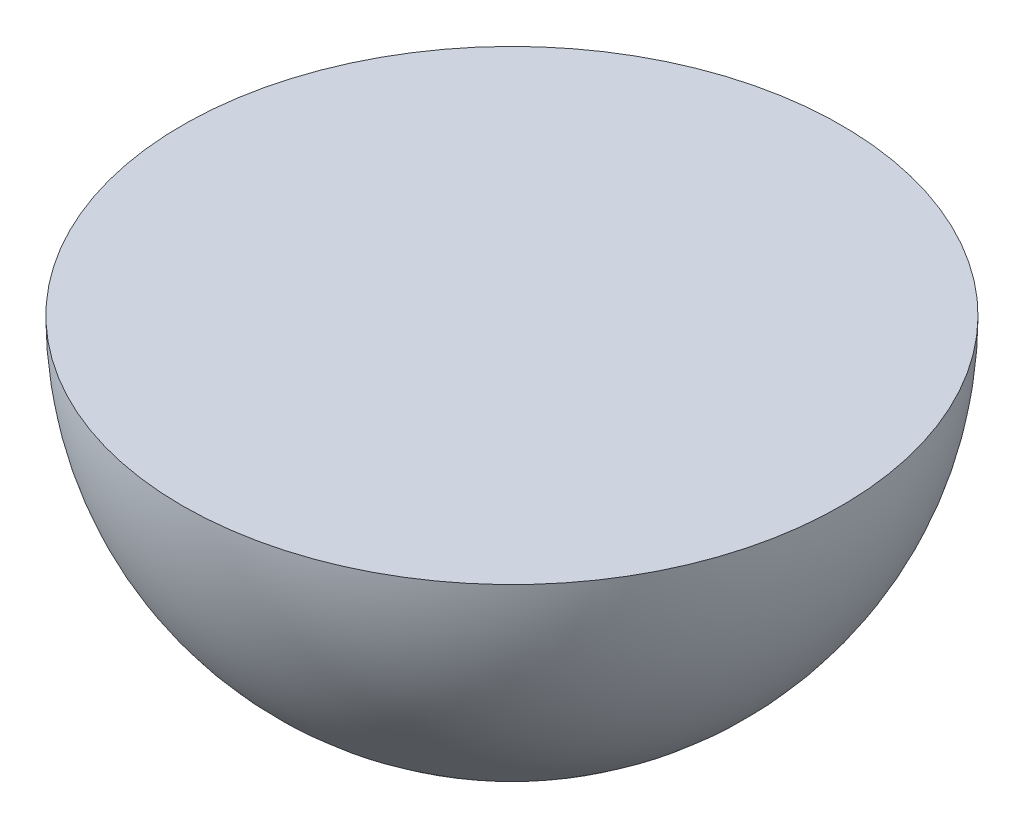
ISO-10303-21;
HEADER;
FILE_DESCRIPTION(('STEP AP214'),'2;1');
FILE_NAME('part.step','',(''),(''),'','','');
FILE_SCHEMA(('AUTOMOTIVE_DESIGN { 1 0 10303 214 1 1 1 1 }'));
ENDSEC;
DATA;
#1=APPLICATION_CONTEXT('core data for automotive mechanical design processes');
#2=APPLICATION_PROTOCOL_DEFINITION('international standard','automotive_design',2000,#1);
#3=PRODUCT_CONTEXT('',#1,'mechanical');
#4=PRODUCT('Part','Part','',(#3));
#5=PRODUCT_RELATED_PRODUCT_CATEGORY('part','',(#4));
#6=PRODUCT_DEFINITION_FORMATION('','',#4);
#7=PRODUCT_DEFINITION_CONTEXT('part definition',#1,'design');
#8=PRODUCT_DEFINITION('design','',#6,#7);
#9=PRODUCT_DEFINITION_SHAPE('','',#8);
#10=(LENGTH_UNIT() NAMED_UNIT(*) SI_UNIT(.MILLI.,.METRE.));
#11=(NAMED_UNIT(*) PLANE_ANGLE_UNIT() SI_UNIT($,.RADIAN.));
#12=(NAMED_UNIT(*) SI_UNIT($,.STERADIAN.) SOLID_ANGLE_UNIT());
#13=UNCERTAINTY_MEASURE_WITH_UNIT(LENGTH_MEASURE(1.E-05),#10,'distance_accuracy_value','');
#14=(GEOMETRIC_REPRESENTATION_CONTEXT(3) GLOBAL_UNCERTAINTY_ASSIGNED_CONTEXT((#13)) GLOBAL_UNIT_ASSIGNED_CONTEXT((#10,
#11,#12)) REPRESENTATION_CONTEXT('',''));
#15=CARTESIAN_POINT('',(0.,0.,0.));
#16=DIRECTION('',(0.,0.,1.));
#17=DIRECTION('',(1.,0.,0.));
#18=AXIS2_PLACEMENT_3D('',#15,#16,#17);
#19=CARTESIAN_POINT('',(0.,1.63043478260868,325.));
#20=DIRECTION('',(0.,1.,0.));
#21=DIRECTION('',(0.,0.,1.));
#22=AXIS2_PLACEMENT_3D('',#19,#20,#21);
#23=SPHERICAL_SURFACE('',#22,100.);
#24=CARTESIAN_POINT('',(0.,1.63043478260869,325.));
#25=DIRECTION('',(0.,1.,0.));
#26=DIRECTION('',(0.,0.,1.));
#27=AXIS2_PLACEMENT_3D('',#24,#25,#26);
#28=CIRCLE('',#27,100.);
#29=CARTESIAN_POINT('',(0.,1.63043478260869,425.));
#30=VERTEX_POINT('',#29);
#31=EDGE_CURVE('E10',#30,#30,#28,.T.);
#32=ORIENTED_EDGE('',*,*,#31,.F.);
#33=EDGE_LOOP('',(#32));
#34=FACE_BOUND('',#33,.T.);
#35=ADVANCED_FACE('F37',(#34),#23,.T.);
#36=CARTESIAN_POINT('',(0.,1.63043478260868,325.));
#37=DIRECTION('',(0.,1.,0.));
#38=DIRECTION('',(0.,0.,1.));
#39=AXIS2_PLACEMENT_3D('',#36,#37,#38);
#40=PLANE('',#39);
#41=ORIENTED_EDGE('',*,*,#31,.T.);
#42=EDGE_LOOP('',(#41));
#43=FACE_BOUND('',#42,.T.);
#44=ADVANCED_FACE('F45',(#43),#40,.T.);
#45=CLOSED_SHELL('',(#35,#44));
#46=MANIFOLD_SOLID_BREP('B2',#45);
#47=ADVANCED_BREP_SHAPE_REPRESENTATION('',(#18,#46),#14);
#48=SHAPE_DEFINITION_REPRESENTATION(#9,#47);
ENDSEC;
END-ISO-10303-21;
